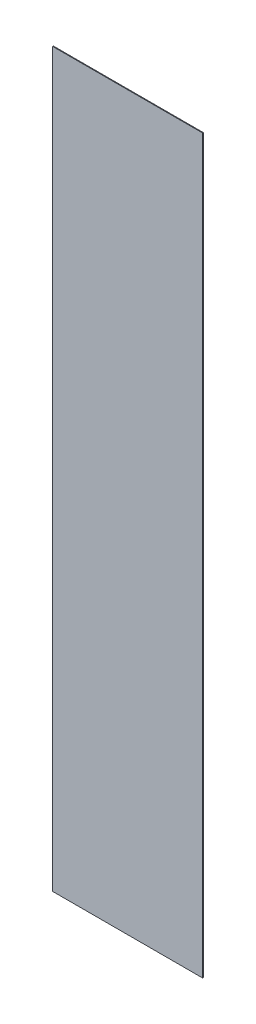
ISO-10303-21;
HEADER;
FILE_DESCRIPTION(('STEP AP214'),'2;1');
FILE_NAME('part.step','',(''),(''),'','','');
FILE_SCHEMA(('AUTOMOTIVE_DESIGN { 1 0 10303 214 1 1 1 1 }'));
ENDSEC;
DATA;
#1=APPLICATION_CONTEXT('core data for automotive mechanical design processes');
#2=APPLICATION_PROTOCOL_DEFINITION('international standard','automotive_design',2000,#1);
#3=PRODUCT_CONTEXT('',#1,'mechanical');
#4=PRODUCT('Part','Part','',(#3));
#5=PRODUCT_RELATED_PRODUCT_CATEGORY('part','',(#4));
#6=PRODUCT_DEFINITION_FORMATION('','',#4);
#7=PRODUCT_DEFINITION_CONTEXT('part definition',#1,'design');
#8=PRODUCT_DEFINITION('design','',#6,#7);
#9=PRODUCT_DEFINITION_SHAPE('','',#8);
#10=(LENGTH_UNIT() NAMED_UNIT(*) SI_UNIT(.MILLI.,.METRE.));
#11=(NAMED_UNIT(*) PLANE_ANGLE_UNIT() SI_UNIT($,.RADIAN.));
#12=(NAMED_UNIT(*) SI_UNIT($,.STERADIAN.) SOLID_ANGLE_UNIT());
#13=UNCERTAINTY_MEASURE_WITH_UNIT(LENGTH_MEASURE(1.E-05),#10,'distance_accuracy_value','');
#14=(GEOMETRIC_REPRESENTATION_CONTEXT(3) GLOBAL_UNCERTAINTY_ASSIGNED_CONTEXT((#13)) GLOBAL_UNIT_ASSIGNED_CONTEXT((#10,
#11,#12)) REPRESENTATION_CONTEXT('',''));
#15=CARTESIAN_POINT('',(0.,0.,0.));
#16=DIRECTION('',(0.,0.,1.));
#17=DIRECTION('',(1.,0.,0.));
#18=AXIS2_PLACEMENT_3D('',#15,#16,#17);
#19=CARTESIAN_POINT('',(0.,0.,2.));
#20=DIRECTION('',(1.,0.,0.));
#21=DIRECTION('',(0.,0.,-1.));
#22=AXIS2_PLACEMENT_3D('',#19,#20,#21);
#23=PLANE('',#22);
#24=DIRECTION('',(0.,-1.,0.));
#25=VECTOR('',#24,1.);
#26=CARTESIAN_POINT('',(0.,0.,0.));
#27=LINE('',#26,#25);
#28=CARTESIAN_POINT('',(0.,2050.,0.));
#29=VERTEX_POINT('',#28);
#30=CARTESIAN_POINT('',(0.,0.,0.));
#31=VERTEX_POINT('',#30);
#32=EDGE_CURVE('E98',#29,#31,#27,.T.);
#33=ORIENTED_EDGE('',*,*,#32,.T.);
#34=DIRECTION('',(0.,0.,-1.));
#35=VECTOR('',#34,1.);
#36=CARTESIAN_POINT('',(0.,0.,2.));
#37=LINE('',#36,#35);
#38=CARTESIAN_POINT('',(0.,0.,2.));
#39=VERTEX_POINT('',#38);
#40=EDGE_CURVE('E11',#39,#31,#37,.T.);
#41=ORIENTED_EDGE('',*,*,#40,.F.);
#42=DIRECTION('',(0.,-1.,0.));
#43=VECTOR('',#42,1.);
#44=CARTESIAN_POINT('',(0.,0.,2.));
#45=LINE('',#44,#43);
#46=CARTESIAN_POINT('',(0.,2050.,2.));
#47=VERTEX_POINT('',#46);
#48=EDGE_CURVE('E86',#47,#39,#45,.T.);
#49=ORIENTED_EDGE('',*,*,#48,.F.);
#50=DIRECTION('',(0.,0.,-1.));
#51=VECTOR('',#50,1.);
#52=CARTESIAN_POINT('',(0.,2050.,2.));
#53=LINE('',#52,#51);
#54=EDGE_CURVE('E94',#47,#29,#53,.T.);
#55=ORIENTED_EDGE('',*,*,#54,.T.);
#56=EDGE_LOOP('',(#33,#41,#49,#55));
#57=FACE_BOUND('',#56,.T.);
#58=ADVANCED_FACE('F35',(#57),#23,.F.);
#59=CARTESIAN_POINT('',(0.,0.,2.));
#60=DIRECTION('',(0.,1.,0.));
#61=DIRECTION('',(0.,0.,1.));
#62=AXIS2_PLACEMENT_3D('',#59,#60,#61);
#63=PLANE('',#62);
#64=DIRECTION('',(1.,0.,0.));
#65=VECTOR('',#64,1.);
#66=CARTESIAN_POINT('',(0.,0.,0.));
#67=LINE('',#66,#65);
#68=CARTESIAN_POINT('',(420.,0.,0.));
#69=VERTEX_POINT('',#68);
#70=EDGE_CURVE('E90',#31,#69,#67,.T.);
#71=ORIENTED_EDGE('',*,*,#70,.T.);
#72=DIRECTION('',(0.,0.,-1.));
#73=VECTOR('',#72,1.);
#74=CARTESIAN_POINT('',(420.,0.,2.));
#75=LINE('',#74,#73);
#76=CARTESIAN_POINT('',(420.,0.,2.));
#77=VERTEX_POINT('',#76);
#78=EDGE_CURVE('E43',#77,#69,#75,.T.);
#79=ORIENTED_EDGE('',*,*,#78,.F.);
#80=DIRECTION('',(1.,0.,0.));
#81=VECTOR('',#80,1.);
#82=CARTESIAN_POINT('',(0.,0.,2.));
#83=LINE('',#82,#81);
#84=EDGE_CURVE('E81',#39,#77,#83,.T.);
#85=ORIENTED_EDGE('',*,*,#84,.F.);
#86=ORIENTED_EDGE('',*,*,#40,.T.);
#87=EDGE_LOOP('',(#71,#79,#85,#86));
#88=FACE_BOUND('',#87,.T.);
#89=ADVANCED_FACE('F89',(#88),#63,.F.);
#90=CARTESIAN_POINT('',(420.,0.,2.));
#91=DIRECTION('',(-1.,0.,0.));
#92=DIRECTION('',(0.,0.,1.));
#93=AXIS2_PLACEMENT_3D('',#90,#91,#92);
#94=PLANE('',#93);
#95=DIRECTION('',(0.,1.,0.));
#96=VECTOR('',#95,1.);
#97=CARTESIAN_POINT('',(420.,0.,0.));
#98=LINE('',#97,#96);
#99=CARTESIAN_POINT('',(420.,2050.,0.));
#100=VERTEX_POINT('',#99);
#101=EDGE_CURVE('E68',#69,#100,#98,.T.);
#102=ORIENTED_EDGE('',*,*,#101,.T.);
#103=DIRECTION('',(0.,0.,-1.));
#104=VECTOR('',#103,1.);
#105=CARTESIAN_POINT('',(420.,2050.,2.));
#106=LINE('',#105,#104);
#107=CARTESIAN_POINT('',(420.,2050.,2.));
#108=VERTEX_POINT('',#107);
#109=EDGE_CURVE('E91',#108,#100,#106,.T.);
#110=ORIENTED_EDGE('',*,*,#109,.F.);
#111=DIRECTION('',(0.,1.,0.));
#112=VECTOR('',#111,1.);
#113=CARTESIAN_POINT('',(420.,0.,2.));
#114=LINE('',#113,#112);
#115=EDGE_CURVE('E84',#77,#108,#114,.T.);
#116=ORIENTED_EDGE('',*,*,#115,.F.);
#117=ORIENTED_EDGE('',*,*,#78,.T.);
#118=EDGE_LOOP('',(#102,#110,#116,#117));
#119=FACE_BOUND('',#118,.T.);
#120=ADVANCED_FACE('F92',(#119),#94,.F.);
#121=CARTESIAN_POINT('',(0.,2050.,2.));
#122=DIRECTION('',(0.,-1.,0.));
#123=DIRECTION('',(0.,0.,-1.));
#124=AXIS2_PLACEMENT_3D('',#121,#122,#123);
#125=PLANE('',#124);
#126=DIRECTION('',(-1.,0.,0.));
#127=VECTOR('',#126,1.);
#128=CARTESIAN_POINT('',(0.,2050.,0.));
#129=LINE('',#128,#127);
#130=EDGE_CURVE('E74',#100,#29,#129,.T.);
#131=ORIENTED_EDGE('',*,*,#130,.T.);
#132=ORIENTED_EDGE('',*,*,#54,.F.);
#133=DIRECTION('',(-1.,0.,0.));
#134=VECTOR('',#133,1.);
#135=CARTESIAN_POINT('',(0.,2050.,2.));
#136=LINE('',#135,#134);
#137=EDGE_CURVE('E51',#108,#47,#136,.T.);
#138=ORIENTED_EDGE('',*,*,#137,.F.);
#139=ORIENTED_EDGE('',*,*,#109,.T.);
#140=EDGE_LOOP('',(#131,#132,#138,#139));
#141=FACE_BOUND('',#140,.T.);
#142=ADVANCED_FACE('F105',(#141),#125,.F.);
#143=CARTESIAN_POINT('',(0.,0.,2.));
#144=DIRECTION('',(0.,0.,-1.));
#145=DIRECTION('',(-1.,0.,0.));
#146=AXIS2_PLACEMENT_3D('',#143,#144,#145);
#147=PLANE('',#146);
#148=ORIENTED_EDGE('',*,*,#48,.T.);
#149=ORIENTED_EDGE('',*,*,#84,.T.);
#150=ORIENTED_EDGE('',*,*,#115,.T.);
#151=ORIENTED_EDGE('',*,*,#137,.T.);
#152=EDGE_LOOP('',(#148,#149,#150,#151));
#153=FACE_BOUND('',#152,.T.);
#154=ADVANCED_FACE('F82',(#153),#147,.F.);
#155=CARTESIAN_POINT('',(0.,0.,0.));
#156=DIRECTION('',(0.,0.,-1.));
#157=DIRECTION('',(-1.,0.,0.));
#158=AXIS2_PLACEMENT_3D('',#155,#156,#157);
#159=PLANE('',#158);
#160=ORIENTED_EDGE('',*,*,#32,.F.);
#161=ORIENTED_EDGE('',*,*,#130,.F.);
#162=ORIENTED_EDGE('',*,*,#101,.F.);
#163=ORIENTED_EDGE('',*,*,#70,.F.);
#164=EDGE_LOOP('',(#160,#161,#162,#163));
#165=FACE_BOUND('',#164,.T.);
#166=ADVANCED_FACE('F108',(#165),#159,.T.);
#167=CLOSED_SHELL('',(#58,#89,#120,#142,#154,#166));
#168=MANIFOLD_SOLID_BREP('B2',#167);
#169=ADVANCED_BREP_SHAPE_REPRESENTATION('',(#18,#168),#14);
#170=SHAPE_DEFINITION_REPRESENTATION(#9,#169);
ENDSEC;
END-ISO-10303-21;
